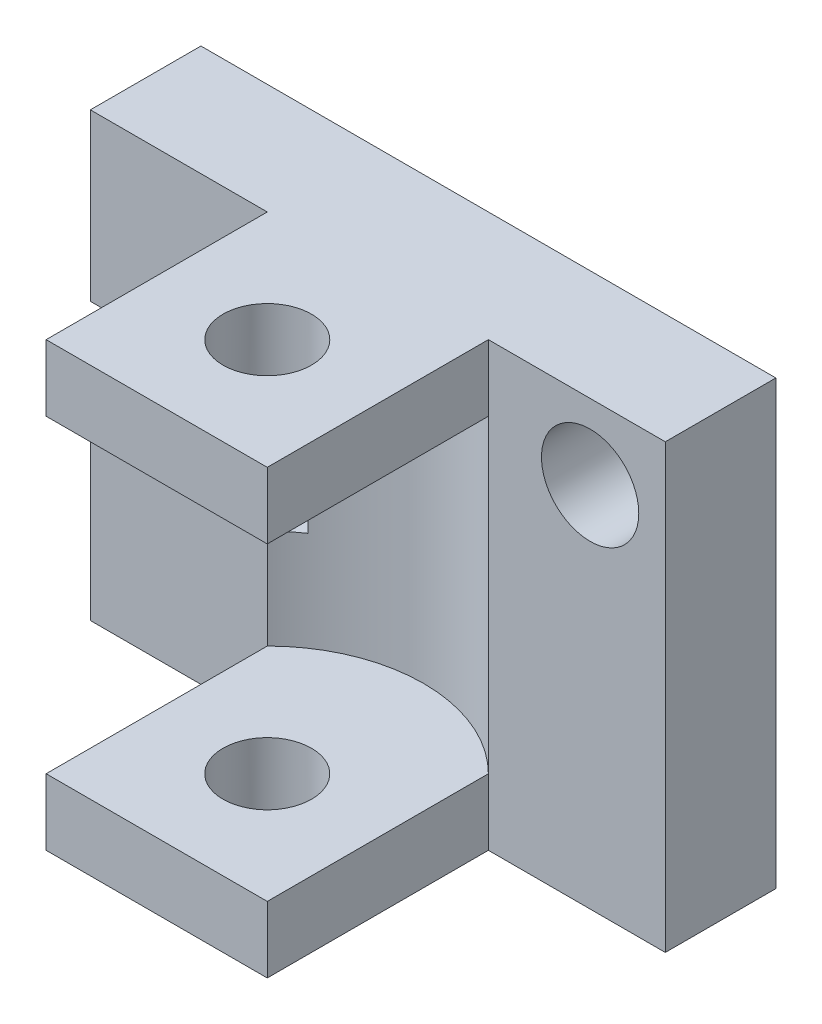
ISO-10303-21;
HEADER;
FILE_DESCRIPTION(('STEP AP214'),'2;1');
FILE_NAME('part.step','',(''),(''),'','','');
FILE_SCHEMA(('AUTOMOTIVE_DESIGN { 1 0 10303 214 1 1 1 1 }'));
ENDSEC;
DATA;
#1=APPLICATION_CONTEXT('core data for automotive mechanical design processes');
#2=APPLICATION_PROTOCOL_DEFINITION('international standard','automotive_design',2000,#1);
#3=PRODUCT_CONTEXT('',#1,'mechanical');
#4=PRODUCT('Part','Part','',(#3));
#5=PRODUCT_RELATED_PRODUCT_CATEGORY('part','',(#4));
#6=PRODUCT_DEFINITION_FORMATION('','',#4);
#7=PRODUCT_DEFINITION_CONTEXT('part definition',#1,'design');
#8=PRODUCT_DEFINITION('design','',#6,#7);
#9=PRODUCT_DEFINITION_SHAPE('','',#8);
#10=(LENGTH_UNIT() NAMED_UNIT(*) SI_UNIT(.MILLI.,.METRE.));
#11=(NAMED_UNIT(*) PLANE_ANGLE_UNIT() SI_UNIT($,.RADIAN.));
#12=(NAMED_UNIT(*) SI_UNIT($,.STERADIAN.) SOLID_ANGLE_UNIT());
#13=UNCERTAINTY_MEASURE_WITH_UNIT(LENGTH_MEASURE(1.E-05),#10,'distance_accuracy_value','');
#14=(GEOMETRIC_REPRESENTATION_CONTEXT(3) GLOBAL_UNCERTAINTY_ASSIGNED_CONTEXT((#13)) GLOBAL_UNIT_ASSIGNED_CONTEXT((#10,
#11,#12)) REPRESENTATION_CONTEXT('',''));
#15=CARTESIAN_POINT('',(0.,0.,0.));
#16=DIRECTION('',(0.,0.,1.));
#17=DIRECTION('',(1.,0.,0.));
#18=AXIS2_PLACEMENT_3D('',#15,#16,#17);
#19=CARTESIAN_POINT('',(0.,0.,25.));
#20=DIRECTION('',(0.,0.,-1.));
#21=DIRECTION('',(-1.,0.,0.));
#22=AXIS2_PLACEMENT_3D('',#19,#20,#21);
#23=PLANE('',#22);
#24=DIRECTION('',(0.,-1.,0.));
#25=VECTOR('',#24,1.);
#26=CARTESIAN_POINT('',(-65.,-50.,25.));
#27=LINE('',#26,#25);
#28=CARTESIAN_POINT('',(-65.,50.,25.));
#29=VERTEX_POINT('',#28);
#30=CARTESIAN_POINT('',(-65.,12.5,25.));
#31=VERTEX_POINT('',#30);
#32=EDGE_CURVE('E270',#29,#31,#27,.T.);
#33=ORIENTED_EDGE('',*,*,#32,.T.);
#34=DIRECTION('',(-1.,0.,0.));
#35=VECTOR('',#34,1.);
#36=CARTESIAN_POINT('',(-20.,12.5,25.));
#37=LINE('',#36,#35);
#38=CARTESIAN_POINT('',(-25.,12.5,25.));
#39=VERTEX_POINT('',#38);
#40=EDGE_CURVE('E172',#39,#31,#37,.T.);
#41=ORIENTED_EDGE('',*,*,#40,.F.);
#42=DIRECTION('',(0.,1.,0.));
#43=VECTOR('',#42,1.);
#44=CARTESIAN_POINT('',(-25.,-120.710678118655,25.));
#45=LINE('',#44,#43);
#46=CARTESIAN_POINT('',(-25.,35.,25.));
#47=VERTEX_POINT('',#46);
#48=EDGE_CURVE('E244',#39,#47,#45,.T.);
#49=ORIENTED_EDGE('',*,*,#48,.T.);
#50=CARTESIAN_POINT('',(-25.,50.,25.));
#51=VERTEX_POINT('',#50);
#52=EDGE_CURVE('E242',#47,#51,#45,.T.);
#53=ORIENTED_EDGE('',*,*,#52,.T.);
#54=DIRECTION('',(-1.,0.,0.));
#55=VECTOR('',#54,1.);
#56=CARTESIAN_POINT('',(-65.,50.,25.));
#57=LINE('',#56,#55);
#58=EDGE_CURVE('E272',#51,#29,#57,.T.);
#59=ORIENTED_EDGE('',*,*,#58,.T.);
#60=EDGE_LOOP('',(#33,#41,#49,#53,#59));
#61=FACE_BOUND('',#60,.T.);
#62=ADVANCED_FACE('F35',(#61),#23,.F.);
#63=CARTESIAN_POINT('',(25.,-120.710678118655,75.));
#64=DIRECTION('',(0.,0.,1.));
#65=DIRECTION('',(1.,0.,0.));
#66=AXIS2_PLACEMENT_3D('',#63,#64,#65);
#67=PLANE('',#66);
#68=DIRECTION('',(0.,1.,0.));
#69=VECTOR('',#68,1.);
#70=CARTESIAN_POINT('',(-25.,-120.710678118655,75.));
#71=LINE('',#70,#69);
#72=CARTESIAN_POINT('',(-25.,35.,75.));
#73=VERTEX_POINT('',#72);
#74=CARTESIAN_POINT('',(-25.,50.,75.));
#75=VERTEX_POINT('',#74);
#76=EDGE_CURVE('E335',#73,#75,#71,.T.);
#77=ORIENTED_EDGE('',*,*,#76,.F.);
#78=DIRECTION('',(1.,0.,0.));
#79=VECTOR('',#78,1.);
#80=CARTESIAN_POINT('',(25.,35.,75.));
#81=LINE('',#80,#79);
#82=CARTESIAN_POINT('',(25.,35.,75.));
#83=VERTEX_POINT('',#82);
#84=EDGE_CURVE('E200',#73,#83,#81,.T.);
#85=ORIENTED_EDGE('',*,*,#84,.T.);
#86=DIRECTION('',(0.,1.,0.));
#87=VECTOR('',#86,1.);
#88=CARTESIAN_POINT('',(25.,-120.710678118655,75.));
#89=LINE('',#88,#87);
#90=CARTESIAN_POINT('',(25.,50.,75.));
#91=VERTEX_POINT('',#90);
#92=EDGE_CURVE('E581',#83,#91,#89,.T.);
#93=ORIENTED_EDGE('',*,*,#92,.T.);
#94=DIRECTION('',(1.,0.,0.));
#95=VECTOR('',#94,1.);
#96=CARTESIAN_POINT('',(25.,50.,75.));
#97=LINE('',#96,#95);
#98=EDGE_CURVE('E222',#75,#91,#97,.T.);
#99=ORIENTED_EDGE('',*,*,#98,.F.);
#100=EDGE_LOOP('',(#77,#85,#93,#99));
#101=FACE_BOUND('',#100,.T.);
#102=ADVANCED_FACE('F407',(#101),#67,.T.);
#103=CARTESIAN_POINT('',(25.,-120.710678118655,75.));
#104=DIRECTION('',(1.,0.,0.));
#105=DIRECTION('',(0.,0.,-1.));
#106=AXIS2_PLACEMENT_3D('',#103,#104,#105);
#107=PLANE('',#106);
#108=ORIENTED_EDGE('',*,*,#92,.F.);
#109=DIRECTION('',(0.,0.,-1.));
#110=VECTOR('',#109,1.);
#111=CARTESIAN_POINT('',(25.,35.,75.));
#112=LINE('',#111,#110);
#113=CARTESIAN_POINT('',(25.,35.,25.));
#114=VERTEX_POINT('',#113);
#115=EDGE_CURVE('E203',#83,#114,#112,.T.);
#116=ORIENTED_EDGE('',*,*,#115,.T.);
#117=DIRECTION('',(0.,1.,0.));
#118=VECTOR('',#117,1.);
#119=CARTESIAN_POINT('',(25.,-120.710678118655,25.));
#120=LINE('',#119,#118);
#121=CARTESIAN_POINT('',(25.,50.,25.));
#122=VERTEX_POINT('',#121);
#123=EDGE_CURVE('E246',#114,#122,#120,.T.);
#124=ORIENTED_EDGE('',*,*,#123,.T.);
#125=DIRECTION('',(0.,0.,-1.));
#126=VECTOR('',#125,1.);
#127=CARTESIAN_POINT('',(25.,50.,75.));
#128=LINE('',#127,#126);
#129=EDGE_CURVE('E225',#91,#122,#128,.T.);
#130=ORIENTED_EDGE('',*,*,#129,.F.);
#131=EDGE_LOOP('',(#108,#116,#124,#130));
#132=FACE_BOUND('',#131,.T.);
#133=ADVANCED_FACE('F399',(#132),#107,.T.);
#134=CARTESIAN_POINT('',(-25.,-120.710678118655,75.));
#135=DIRECTION('',(-1.,0.,0.));
#136=DIRECTION('',(0.,0.,1.));
#137=AXIS2_PLACEMENT_3D('',#134,#135,#136);
#138=PLANE('',#137);
#139=ORIENTED_EDGE('',*,*,#52,.F.);
#140=DIRECTION('',(0.,0.,1.));
#141=VECTOR('',#140,1.);
#142=CARTESIAN_POINT('',(-25.,35.,75.));
#143=LINE('',#142,#141);
#144=EDGE_CURVE('E197',#47,#73,#143,.T.);
#145=ORIENTED_EDGE('',*,*,#144,.T.);
#146=ORIENTED_EDGE('',*,*,#76,.T.);
#147=DIRECTION('',(0.,0.,1.));
#148=VECTOR('',#147,1.);
#149=CARTESIAN_POINT('',(-25.,50.,75.));
#150=LINE('',#149,#148);
#151=EDGE_CURVE('E221',#51,#75,#150,.T.);
#152=ORIENTED_EDGE('',*,*,#151,.F.);
#153=EDGE_LOOP('',(#139,#145,#146,#152));
#154=FACE_BOUND('',#153,.T.);
#155=ADVANCED_FACE('F377',(#154),#138,.T.);
#156=CARTESIAN_POINT('',(0.,-120.710678118655,50.));
#157=DIRECTION('',(0.,1.,0.));
#158=DIRECTION('',(0.,0.,1.));
#159=AXIS2_PLACEMENT_3D('',#156,#157,#158);
#160=CYLINDRICAL_SURFACE('',#159,10.);
#161=CARTESIAN_POINT('',(0.,50.,50.));
#162=DIRECTION('',(0.,1.,0.));
#163=DIRECTION('',(0.,0.,1.));
#164=AXIS2_PLACEMENT_3D('',#161,#162,#163);
#165=CIRCLE('',#164,10.);
#166=CARTESIAN_POINT('',(0.,50.,60.));
#167=VERTEX_POINT('',#166);
#168=EDGE_CURVE('E212',#167,#167,#165,.T.);
#169=ORIENTED_EDGE('',*,*,#168,.T.);
#170=EDGE_LOOP('',(#169));
#171=FACE_BOUND('',#170,.T.);
#172=CARTESIAN_POINT('',(0.,35.,50.));
#173=DIRECTION('',(0.,-1.,0.));
#174=DIRECTION('',(0.,0.,-1.));
#175=AXIS2_PLACEMENT_3D('',#172,#173,#174);
#176=CIRCLE('',#175,10.);
#177=CARTESIAN_POINT('',(0.,35.,40.));
#178=VERTEX_POINT('',#177);
#179=EDGE_CURVE('E196',#178,#178,#176,.F.);
#180=ORIENTED_EDGE('',*,*,#179,.F.);
#181=EDGE_LOOP('',(#180));
#182=FACE_BOUND('',#181,.T.);
#183=ADVANCED_FACE('F388',(#171,#182),#160,.F.);
#184=CARTESIAN_POINT('',(48.,33.,25.));
#185=DIRECTION('',(0.,0.,1.));
#186=DIRECTION('',(1.,0.,0.));
#187=AXIS2_PLACEMENT_3D('',#184,#185,#186);
#188=CIRCLE('',#187,11.);
#189=CARTESIAN_POINT('',(59.,33.,25.));
#190=VERTEX_POINT('',#189);
#191=EDGE_CURVE('E208',#190,#190,#188,.T.);
#192=ORIENTED_EDGE('',*,*,#191,.F.);
#193=EDGE_LOOP('',(#192));
#194=FACE_BOUND('',#193,.T.);
#195=CARTESIAN_POINT('',(25.,-50.,25.));
#196=VERTEX_POINT('',#195);
#197=CARTESIAN_POINT('',(25.,-35.,25.));
#198=VERTEX_POINT('',#197);
#199=EDGE_CURVE('E245',#196,#198,#120,.T.);
#200=ORIENTED_EDGE('',*,*,#199,.F.);
#201=DIRECTION('',(1.,0.,0.));
#202=VECTOR('',#201,1.);
#203=CARTESIAN_POINT('',(-65.,-50.,25.));
#204=LINE('',#203,#202);
#205=CARTESIAN_POINT('',(65.,-50.,25.));
#206=VERTEX_POINT('',#205);
#207=EDGE_CURVE('E274',#196,#206,#204,.T.);
#208=ORIENTED_EDGE('',*,*,#207,.T.);
#209=DIRECTION('',(0.,1.,0.));
#210=VECTOR('',#209,1.);
#211=CARTESIAN_POINT('',(65.,-50.,25.));
#212=LINE('',#211,#210);
#213=CARTESIAN_POINT('',(65.,50.,25.));
#214=VERTEX_POINT('',#213);
#215=EDGE_CURVE('E293',#206,#214,#212,.T.);
#216=ORIENTED_EDGE('',*,*,#215,.T.);
#217=EDGE_CURVE('E278',#214,#122,#57,.T.);
#218=ORIENTED_EDGE('',*,*,#217,.T.);
#219=ORIENTED_EDGE('',*,*,#123,.F.);
#220=DIRECTION('',(0.,-1.,0.));
#221=VECTOR('',#220,1.);
#222=CARTESIAN_POINT('',(25.,35.,25.));
#223=LINE('',#222,#221);
#224=EDGE_CURVE('E206',#198,#114,#223,.F.);
#225=ORIENTED_EDGE('',*,*,#224,.F.);
#226=EDGE_LOOP('',(#200,#208,#216,#218,#219,#225));
#227=FACE_BOUND('',#226,.T.);
#228=ADVANCED_FACE('F323',(#194,#227),#23,.F.);
#229=CARTESIAN_POINT('',(65.,-50.,25.));
#230=DIRECTION('',(-1.,0.,0.));
#231=DIRECTION('',(0.,0.,1.));
#232=AXIS2_PLACEMENT_3D('',#229,#230,#231);
#233=PLANE('',#232);
#234=DIRECTION('',(0.,1.,0.));
#235=VECTOR('',#234,1.);
#236=CARTESIAN_POINT('',(65.,-50.,0.));
#237=LINE('',#236,#235);
#238=CARTESIAN_POINT('',(65.,-50.,0.));
#239=VERTEX_POINT('',#238);
#240=CARTESIAN_POINT('',(65.,50.,0.));
#241=VERTEX_POINT('',#240);
#242=EDGE_CURVE('E285',#239,#241,#237,.T.);
#243=ORIENTED_EDGE('',*,*,#242,.T.);
#244=DIRECTION('',(0.,0.,-1.));
#245=VECTOR('',#244,1.);
#246=CARTESIAN_POINT('',(65.,50.,25.));
#247=LINE('',#246,#245);
#248=EDGE_CURVE('E250',#214,#241,#247,.T.);
#249=ORIENTED_EDGE('',*,*,#248,.F.);
#250=ORIENTED_EDGE('',*,*,#215,.F.);
#251=DIRECTION('',(0.,0.,-1.));
#252=VECTOR('',#251,1.);
#253=CARTESIAN_POINT('',(65.,-50.,25.));
#254=LINE('',#253,#252);
#255=EDGE_CURVE('E291',#206,#239,#254,.T.);
#256=ORIENTED_EDGE('',*,*,#255,.T.);
#257=EDGE_LOOP('',(#243,#249,#250,#256));
#258=FACE_BOUND('',#257,.T.);
#259=ADVANCED_FACE('F37',(#258),#233,.F.);
#260=CARTESIAN_POINT('',(-65.,50.,25.));
#261=DIRECTION('',(0.,-1.,0.));
#262=DIRECTION('',(0.,0.,-1.));
#263=AXIS2_PLACEMENT_3D('',#260,#261,#262);
#264=PLANE('',#263);
#265=DIRECTION('',(-1.,0.,0.));
#266=VECTOR('',#265,1.);
#267=CARTESIAN_POINT('',(-65.,50.,0.));
#268=LINE('',#267,#266);
#269=CARTESIAN_POINT('',(-65.,50.,0.));
#270=VERTEX_POINT('',#269);
#271=EDGE_CURVE('E308',#241,#270,#268,.T.);
#272=ORIENTED_EDGE('',*,*,#271,.T.);
#273=DIRECTION('',(0.,0.,-1.));
#274=VECTOR('',#273,1.);
#275=CARTESIAN_POINT('',(-65.,50.,25.));
#276=LINE('',#275,#274);
#277=EDGE_CURVE('E298',#29,#270,#276,.T.);
#278=ORIENTED_EDGE('',*,*,#277,.F.);
#279=ORIENTED_EDGE('',*,*,#58,.F.);
#280=ORIENTED_EDGE('',*,*,#151,.T.);
#281=ORIENTED_EDGE('',*,*,#98,.T.);
#282=ORIENTED_EDGE('',*,*,#129,.T.);
#283=ORIENTED_EDGE('',*,*,#217,.F.);
#284=ORIENTED_EDGE('',*,*,#248,.T.);
#285=EDGE_LOOP('',(#272,#278,#279,#280,#281,#282,#283,#284));
#286=FACE_BOUND('',#285,.T.);
#287=ORIENTED_EDGE('',*,*,#168,.F.);
#288=EDGE_LOOP('',(#287));
#289=FACE_BOUND('',#288,.T.);
#290=ADVANCED_FACE('F328',(#286,#289),#264,.F.);
#291=CARTESIAN_POINT('',(-65.,-50.,25.));
#292=DIRECTION('',(1.,0.,0.));
#293=DIRECTION('',(0.,0.,-1.));
#294=AXIS2_PLACEMENT_3D('',#291,#292,#293);
#295=PLANE('',#294);
#296=DIRECTION('',(0.,-1.,0.));
#297=VECTOR('',#296,1.);
#298=CARTESIAN_POINT('',(-65.,-12.5,10.));
#299=LINE('',#298,#297);
#300=CARTESIAN_POINT('',(-65.,12.5,10.));
#301=VERTEX_POINT('',#300);
#302=CARTESIAN_POINT('',(-65.,-12.5,10.));
#303=VERTEX_POINT('',#302);
#304=EDGE_CURVE('E163',#301,#303,#299,.T.);
#305=ORIENTED_EDGE('',*,*,#304,.F.);
#306=DIRECTION('',(0.,0.,1.));
#307=VECTOR('',#306,1.);
#308=CARTESIAN_POINT('',(-65.,12.5,10.));
#309=LINE('',#308,#307);
#310=EDGE_CURVE('E189',#301,#31,#309,.T.);
#311=ORIENTED_EDGE('',*,*,#310,.T.);
#312=ORIENTED_EDGE('',*,*,#32,.F.);
#313=ORIENTED_EDGE('',*,*,#277,.T.);
#314=DIRECTION('',(0.,-1.,0.));
#315=VECTOR('',#314,1.);
#316=CARTESIAN_POINT('',(-65.,-50.,0.));
#317=LINE('',#316,#315);
#318=CARTESIAN_POINT('',(-65.,-50.,0.));
#319=VERTEX_POINT('',#318);
#320=EDGE_CURVE('E307',#270,#319,#317,.T.);
#321=ORIENTED_EDGE('',*,*,#320,.T.);
#322=DIRECTION('',(0.,0.,-1.));
#323=VECTOR('',#322,1.);
#324=CARTESIAN_POINT('',(-65.,-50.,25.));
#325=LINE('',#324,#323);
#326=CARTESIAN_POINT('',(-65.,-50.,25.));
#327=VERTEX_POINT('',#326);
#328=EDGE_CURVE('E300',#327,#319,#325,.T.);
#329=ORIENTED_EDGE('',*,*,#328,.F.);
#330=CARTESIAN_POINT('',(-65.,-12.5,25.));
#331=VERTEX_POINT('',#330);
#332=EDGE_CURVE('E177',#331,#327,#27,.T.);
#333=ORIENTED_EDGE('',*,*,#332,.F.);
#334=DIRECTION('',(0.,0.,1.));
#335=VECTOR('',#334,1.);
#336=CARTESIAN_POINT('',(-65.,-12.5,10.));
#337=LINE('',#336,#335);
#338=EDGE_CURVE('E156',#303,#331,#337,.T.);
#339=ORIENTED_EDGE('',*,*,#338,.F.);
#340=EDGE_LOOP('',(#305,#311,#312,#313,#321,#329,#333,#339));
#341=FACE_BOUND('',#340,.T.);
#342=ADVANCED_FACE('F175',(#341),#295,.F.);
#343=CARTESIAN_POINT('',(-65.,-50.,25.));
#344=DIRECTION('',(0.,1.,0.));
#345=DIRECTION('',(0.,0.,1.));
#346=AXIS2_PLACEMENT_3D('',#343,#344,#345);
#347=PLANE('',#346);
#348=DIRECTION('',(1.,0.,0.));
#349=VECTOR('',#348,1.);
#350=CARTESIAN_POINT('',(-65.,-50.,0.));
#351=LINE('',#350,#349);
#352=EDGE_CURVE('E305',#319,#239,#351,.T.);
#353=ORIENTED_EDGE('',*,*,#352,.T.);
#354=ORIENTED_EDGE('',*,*,#255,.F.);
#355=ORIENTED_EDGE('',*,*,#207,.F.);
#356=DIRECTION('',(0.,0.,1.));
#357=VECTOR('',#356,1.);
#358=CARTESIAN_POINT('',(25.,-50.,75.));
#359=LINE('',#358,#357);
#360=CARTESIAN_POINT('',(25.,-50.,75.));
#361=VERTEX_POINT('',#360);
#362=EDGE_CURVE('E340',#196,#361,#359,.T.);
#363=ORIENTED_EDGE('',*,*,#362,.T.);
#364=DIRECTION('',(-1.,0.,0.));
#365=VECTOR('',#364,1.);
#366=CARTESIAN_POINT('',(25.,-50.,75.));
#367=LINE('',#366,#365);
#368=CARTESIAN_POINT('',(-25.,-50.,75.));
#369=VERTEX_POINT('',#368);
#370=EDGE_CURVE('E215',#361,#369,#367,.T.);
#371=ORIENTED_EDGE('',*,*,#370,.T.);
#372=DIRECTION('',(0.,0.,-1.));
#373=VECTOR('',#372,1.);
#374=CARTESIAN_POINT('',(-25.,-50.,75.));
#375=LINE('',#374,#373);
#376=CARTESIAN_POINT('',(-25.,-50.,25.));
#377=VERTEX_POINT('',#376);
#378=EDGE_CURVE('E218',#369,#377,#375,.T.);
#379=ORIENTED_EDGE('',*,*,#378,.T.);
#380=EDGE_CURVE('E276',#327,#377,#204,.T.);
#381=ORIENTED_EDGE('',*,*,#380,.F.);
#382=ORIENTED_EDGE('',*,*,#328,.T.);
#383=EDGE_LOOP('',(#353,#354,#355,#363,#371,#379,#381,#382));
#384=FACE_BOUND('',#383,.T.);
#385=CARTESIAN_POINT('',(0.,-50.,50.));
#386=DIRECTION('',(0.,1.,0.));
#387=DIRECTION('',(0.,0.,1.));
#388=AXIS2_PLACEMENT_3D('',#385,#386,#387);
#389=CIRCLE('',#388,10.);
#390=CARTESIAN_POINT('',(0.,-50.,60.));
#391=VERTEX_POINT('',#390);
#392=EDGE_CURVE('E217',#391,#391,#389,.F.);
#393=ORIENTED_EDGE('',*,*,#392,.F.);
#394=EDGE_LOOP('',(#393));
#395=FACE_BOUND('',#394,.T.);
#396=ADVANCED_FACE('F350',(#384,#395),#347,.F.);
#397=CARTESIAN_POINT('',(-25.,-35.,25.));
#398=VERTEX_POINT('',#397);
#399=CARTESIAN_POINT('',(-25.,-12.5,25.));
#400=VERTEX_POINT('',#399);
#401=EDGE_CURVE('E239',#398,#400,#45,.T.);
#402=ORIENTED_EDGE('',*,*,#401,.T.);
#403=DIRECTION('',(1.,0.,0.));
#404=VECTOR('',#403,1.);
#405=CARTESIAN_POINT('',(-20.,-12.5,25.));
#406=LINE('',#405,#404);
#407=EDGE_CURVE('E50',#331,#400,#406,.T.);
#408=ORIENTED_EDGE('',*,*,#407,.F.);
#409=ORIENTED_EDGE('',*,*,#332,.T.);
#410=ORIENTED_EDGE('',*,*,#380,.T.);
#411=EDGE_CURVE('E233',#377,#398,#45,.T.);
#412=ORIENTED_EDGE('',*,*,#411,.T.);
#413=EDGE_LOOP('',(#402,#408,#409,#410,#412));
#414=FACE_BOUND('',#413,.T.);
#415=ADVANCED_FACE('F360',(#414),#23,.F.);
#416=CARTESIAN_POINT('',(0.,0.,0.));
#417=DIRECTION('',(0.,0.,-1.));
#418=DIRECTION('',(-1.,0.,0.));
#419=AXIS2_PLACEMENT_3D('',#416,#417,#418);
#420=PLANE('',#419);
#421=CARTESIAN_POINT('',(48.,33.,0.));
#422=DIRECTION('',(0.,0.,1.));
#423=DIRECTION('',(1.,0.,0.));
#424=AXIS2_PLACEMENT_3D('',#421,#422,#423);
#425=CIRCLE('',#424,11.);
#426=CARTESIAN_POINT('',(59.,33.,0.));
#427=VERTEX_POINT('',#426);
#428=EDGE_CURVE('E209',#427,#427,#425,.T.);
#429=ORIENTED_EDGE('',*,*,#428,.T.);
#430=EDGE_LOOP('',(#429));
#431=FACE_BOUND('',#430,.T.);
#432=ORIENTED_EDGE('',*,*,#242,.F.);
#433=ORIENTED_EDGE('',*,*,#352,.F.);
#434=ORIENTED_EDGE('',*,*,#320,.F.);
#435=ORIENTED_EDGE('',*,*,#271,.F.);
#436=EDGE_LOOP('',(#432,#433,#434,#435));
#437=FACE_BOUND('',#436,.T.);
#438=ADVANCED_FACE('F372',(#431,#437),#420,.T.);
#439=DIRECTION('',(1.,0.,0.));
#440=VECTOR('',#439,1.);
#441=CARTESIAN_POINT('',(25.,-35.,75.));
#442=LINE('',#441,#440);
#443=CARTESIAN_POINT('',(-25.,-35.,75.));
#444=VERTEX_POINT('',#443);
#445=CARTESIAN_POINT('',(25.,-35.,75.));
#446=VERTEX_POINT('',#445);
#447=EDGE_CURVE('E192',#444,#446,#442,.T.);
#448=ORIENTED_EDGE('',*,*,#447,.F.);
#449=EDGE_CURVE('E319',#369,#444,#71,.T.);
#450=ORIENTED_EDGE('',*,*,#449,.F.);
#451=ORIENTED_EDGE('',*,*,#370,.F.);
#452=EDGE_CURVE('E247',#361,#446,#89,.T.);
#453=ORIENTED_EDGE('',*,*,#452,.T.);
#454=EDGE_LOOP('',(#448,#450,#451,#453));
#455=FACE_BOUND('',#454,.T.);
#456=ADVANCED_FACE('F413',(#455),#67,.T.);
#457=DIRECTION('',(0.,0.,-1.));
#458=VECTOR('',#457,1.);
#459=CARTESIAN_POINT('',(25.,-35.,75.));
#460=LINE('',#459,#458);
#461=EDGE_CURVE('E194',#446,#198,#460,.T.);
#462=ORIENTED_EDGE('',*,*,#461,.F.);
#463=ORIENTED_EDGE('',*,*,#452,.F.);
#464=ORIENTED_EDGE('',*,*,#362,.F.);
#465=ORIENTED_EDGE('',*,*,#199,.T.);
#466=EDGE_LOOP('',(#462,#463,#464,#465));
#467=FACE_BOUND('',#466,.T.);
#468=ADVANCED_FACE('F367',(#467),#107,.T.);
#469=DIRECTION('',(0.,0.,1.));
#470=VECTOR('',#469,1.);
#471=CARTESIAN_POINT('',(-25.,-35.,75.));
#472=LINE('',#471,#470);
#473=EDGE_CURVE('E190',#398,#444,#472,.T.);
#474=ORIENTED_EDGE('',*,*,#473,.F.);
#475=ORIENTED_EDGE('',*,*,#411,.F.);
#476=ORIENTED_EDGE('',*,*,#378,.F.);
#477=ORIENTED_EDGE('',*,*,#449,.T.);
#478=EDGE_LOOP('',(#474,#475,#476,#477));
#479=FACE_BOUND('',#478,.T.);
#480=ADVANCED_FACE('F358',(#479),#138,.T.);
#481=CARTESIAN_POINT('',(0.,-35.,50.));
#482=DIRECTION('',(0.,-1.,0.));
#483=DIRECTION('',(0.,0.,-1.));
#484=AXIS2_PLACEMENT_3D('',#481,#482,#483);
#485=CIRCLE('',#484,10.);
#486=CARTESIAN_POINT('',(0.,-35.,40.));
#487=VERTEX_POINT('',#486);
#488=EDGE_CURVE('E187',#487,#487,#485,.F.);
#489=ORIENTED_EDGE('',*,*,#488,.T.);
#490=EDGE_LOOP('',(#489));
#491=FACE_BOUND('',#490,.T.);
#492=ORIENTED_EDGE('',*,*,#392,.T.);
#493=EDGE_LOOP('',(#492));
#494=FACE_BOUND('',#493,.T.);
#495=ADVANCED_FACE('F392',(#491,#494),#160,.F.);
#496=CARTESIAN_POINT('',(48.,33.,0.));
#497=DIRECTION('',(0.,0.,1.));
#498=DIRECTION('',(1.,0.,0.));
#499=AXIS2_PLACEMENT_3D('',#496,#497,#498);
#500=CYLINDRICAL_SURFACE('',#499,11.);
#501=ORIENTED_EDGE('',*,*,#428,.F.);
#502=EDGE_LOOP('',(#501));
#503=FACE_BOUND('',#502,.T.);
#504=ORIENTED_EDGE('',*,*,#191,.T.);
#505=EDGE_LOOP('',(#504));
#506=FACE_BOUND('',#505,.T.);
#507=ADVANCED_FACE('F404',(#503,#506),#500,.F.);
#508=CARTESIAN_POINT('',(0.,35.,50.));
#509=DIRECTION('',(0.,-1.,0.));
#510=DIRECTION('',(0.,0.,-1.));
#511=AXIS2_PLACEMENT_3D('',#508,#509,#510);
#512=PLANE('',#511);
#513=ORIENTED_EDGE('',*,*,#84,.F.);
#514=ORIENTED_EDGE('',*,*,#144,.F.);
#515=CARTESIAN_POINT('',(0.,35.,50.));
#516=DIRECTION('',(0.,-1.,0.));
#517=DIRECTION('',(0.,0.,-1.));
#518=AXIS2_PLACEMENT_3D('',#515,#516,#517);
#519=CIRCLE('',#518,35.3553390593274);
#520=EDGE_CURVE('E184',#47,#114,#519,.T.);
#521=ORIENTED_EDGE('',*,*,#520,.T.);
#522=ORIENTED_EDGE('',*,*,#115,.F.);
#523=EDGE_LOOP('',(#513,#514,#521,#522));
#524=FACE_BOUND('',#523,.T.);
#525=ORIENTED_EDGE('',*,*,#179,.T.);
#526=EDGE_LOOP('',(#525));
#527=FACE_BOUND('',#526,.T.);
#528=ADVANCED_FACE('F386',(#524,#527),#512,.T.);
#529=CARTESIAN_POINT('',(0.,-35.,50.));
#530=DIRECTION('',(0.,-1.,0.));
#531=DIRECTION('',(0.,0.,-1.));
#532=AXIS2_PLACEMENT_3D('',#529,#530,#531);
#533=PLANE('',#532);
#534=ORIENTED_EDGE('',*,*,#461,.T.);
#535=CARTESIAN_POINT('',(0.,-35.,50.));
#536=DIRECTION('',(0.,-1.,0.));
#537=DIRECTION('',(0.,0.,-1.));
#538=AXIS2_PLACEMENT_3D('',#535,#536,#537);
#539=CIRCLE('',#538,35.3553390593274);
#540=EDGE_CURVE('E58',#398,#198,#539,.T.);
#541=ORIENTED_EDGE('',*,*,#540,.F.);
#542=ORIENTED_EDGE('',*,*,#473,.T.);
#543=ORIENTED_EDGE('',*,*,#447,.T.);
#544=EDGE_LOOP('',(#534,#541,#542,#543));
#545=FACE_BOUND('',#544,.T.);
#546=ORIENTED_EDGE('',*,*,#488,.F.);
#547=EDGE_LOOP('',(#546));
#548=FACE_BOUND('',#547,.T.);
#549=ADVANCED_FACE('F481',(#545,#548),#533,.F.);
#550=CARTESIAN_POINT('',(0.,35.,50.));
#551=DIRECTION('',(0.,-1.,0.));
#552=DIRECTION('',(0.,0.,-1.));
#553=AXIS2_PLACEMENT_3D('',#550,#551,#552);
#554=CYLINDRICAL_SURFACE('',#553,35.3553390593274);
#555=ORIENTED_EDGE('',*,*,#48,.F.);
#556=CARTESIAN_POINT('',(0.,12.5,50.));
#557=DIRECTION('',(0.,1.,0.));
#558=DIRECTION('',(-1.,0.,0.));
#559=AXIS2_PLACEMENT_3D('',#556,#557,#558);
#560=CIRCLE('',#559,35.3553390593274);
#561=CARTESIAN_POINT('',(-20.,12.5,20.8452405257735));
#562=VERTEX_POINT('',#561);
#563=EDGE_CURVE('E11',#39,#562,#560,.F.);
#564=ORIENTED_EDGE('',*,*,#563,.T.);
#565=DIRECTION('',(0.,-1.,0.));
#566=VECTOR('',#565,1.);
#567=CARTESIAN_POINT('',(-20.,35.,20.8452405257735));
#568=LINE('',#567,#566);
#569=CARTESIAN_POINT('',(-20.,-12.5,20.8452405257735));
#570=VERTEX_POINT('',#569);
#571=EDGE_CURVE('E43',#562,#570,#568,.T.);
#572=ORIENTED_EDGE('',*,*,#571,.T.);
#573=CARTESIAN_POINT('',(0.,-12.5,50.));
#574=DIRECTION('',(0.,-1.,0.));
#575=DIRECTION('',(1.,0.,0.));
#576=AXIS2_PLACEMENT_3D('',#573,#574,#575);
#577=CIRCLE('',#576,35.3553390593274);
#578=EDGE_CURVE('E249',#570,#400,#577,.F.);
#579=ORIENTED_EDGE('',*,*,#578,.T.);
#580=ORIENTED_EDGE('',*,*,#401,.F.);
#581=ORIENTED_EDGE('',*,*,#540,.T.);
#582=ORIENTED_EDGE('',*,*,#224,.T.);
#583=ORIENTED_EDGE('',*,*,#520,.F.);
#584=EDGE_LOOP('',(#555,#564,#572,#579,#580,#581,#582,#583));
#585=FACE_BOUND('',#584,.T.);
#586=ADVANCED_FACE('F254',(#585),#554,.F.);
#587=CARTESIAN_POINT('',(-20.,12.5,10.));
#588=DIRECTION('',(0.,1.,0.));
#589=DIRECTION('',(-1.,0.,0.));
#590=AXIS2_PLACEMENT_3D('',#587,#588,#589);
#591=PLANE('',#590);
#592=ORIENTED_EDGE('',*,*,#40,.T.);
#593=ORIENTED_EDGE('',*,*,#310,.F.);
#594=DIRECTION('',(-1.,0.,0.));
#595=VECTOR('',#594,1.);
#596=CARTESIAN_POINT('',(-20.,12.5,10.));
#597=LINE('',#596,#595);
#598=CARTESIAN_POINT('',(-20.,12.5,10.));
#599=VERTEX_POINT('',#598);
#600=EDGE_CURVE('E169',#599,#301,#597,.T.);
#601=ORIENTED_EDGE('',*,*,#600,.F.);
#602=DIRECTION('',(0.,0.,1.));
#603=VECTOR('',#602,1.);
#604=CARTESIAN_POINT('',(-20.,12.5,10.));
#605=LINE('',#604,#603);
#606=EDGE_CURVE('E179',#599,#562,#605,.T.);
#607=ORIENTED_EDGE('',*,*,#606,.T.);
#608=ORIENTED_EDGE('',*,*,#563,.F.);
#609=EDGE_LOOP('',(#592,#593,#601,#607,#608));
#610=FACE_BOUND('',#609,.T.);
#611=ADVANCED_FACE('F260',(#610),#591,.F.);
#612=CARTESIAN_POINT('',(-20.,-12.5,10.));
#613=DIRECTION('',(1.,0.,0.));
#614=DIRECTION('',(0.,0.,-1.));
#615=AXIS2_PLACEMENT_3D('',#612,#613,#614);
#616=PLANE('',#615);
#617=ORIENTED_EDGE('',*,*,#606,.F.);
#618=DIRECTION('',(0.,1.,0.));
#619=VECTOR('',#618,1.);
#620=CARTESIAN_POINT('',(-20.,-12.5,10.));
#621=LINE('',#620,#619);
#622=CARTESIAN_POINT('',(-20.,-12.5,10.));
#623=VERTEX_POINT('',#622);
#624=EDGE_CURVE('E162',#623,#599,#621,.T.);
#625=ORIENTED_EDGE('',*,*,#624,.F.);
#626=DIRECTION('',(0.,0.,1.));
#627=VECTOR('',#626,1.);
#628=CARTESIAN_POINT('',(-20.,-12.5,10.));
#629=LINE('',#628,#627);
#630=EDGE_CURVE('E158',#623,#570,#629,.T.);
#631=ORIENTED_EDGE('',*,*,#630,.T.);
#632=ORIENTED_EDGE('',*,*,#571,.F.);
#633=EDGE_LOOP('',(#617,#625,#631,#632));
#634=FACE_BOUND('',#633,.T.);
#635=ADVANCED_FACE('F258',(#634),#616,.F.);
#636=CARTESIAN_POINT('',(-20.,-12.5,10.));
#637=DIRECTION('',(0.,-1.,0.));
#638=DIRECTION('',(1.,0.,0.));
#639=AXIS2_PLACEMENT_3D('',#636,#637,#638);
#640=PLANE('',#639);
#641=ORIENTED_EDGE('',*,*,#630,.F.);
#642=DIRECTION('',(1.,0.,0.));
#643=VECTOR('',#642,1.);
#644=CARTESIAN_POINT('',(-20.,-12.5,10.));
#645=LINE('',#644,#643);
#646=EDGE_CURVE('E152',#303,#623,#645,.T.);
#647=ORIENTED_EDGE('',*,*,#646,.F.);
#648=ORIENTED_EDGE('',*,*,#338,.T.);
#649=ORIENTED_EDGE('',*,*,#407,.T.);
#650=ORIENTED_EDGE('',*,*,#578,.F.);
#651=EDGE_LOOP('',(#641,#647,#648,#649,#650));
#652=FACE_BOUND('',#651,.T.);
#653=ADVANCED_FACE('F154',(#652),#640,.F.);
#654=CARTESIAN_POINT('',(0.,0.,10.));
#655=DIRECTION('',(0.,0.,1.));
#656=DIRECTION('',(1.,0.,0.));
#657=AXIS2_PLACEMENT_3D('',#654,#655,#656);
#658=PLANE('',#657);
#659=ORIENTED_EDGE('',*,*,#304,.T.);
#660=ORIENTED_EDGE('',*,*,#646,.T.);
#661=ORIENTED_EDGE('',*,*,#624,.T.);
#662=ORIENTED_EDGE('',*,*,#600,.T.);
#663=EDGE_LOOP('',(#659,#660,#661,#662));
#664=FACE_BOUND('',#663,.T.);
#665=ADVANCED_FACE('F167',(#664),#658,.T.);
#666=CLOSED_SHELL('',(#62,#102,#133,#155,#183,#228,#259,#290,#342,#396,#415,#438,#456,#468,#480,
#495,#507,#528,#549,#586,#611,#635,#653,#665));
#667=MANIFOLD_SOLID_BREP('B2',#666);
#668=ADVANCED_BREP_SHAPE_REPRESENTATION('',(#18,#667),#14);
#669=SHAPE_DEFINITION_REPRESENTATION(#9,#668);
ENDSEC;
END-ISO-10303-21;
